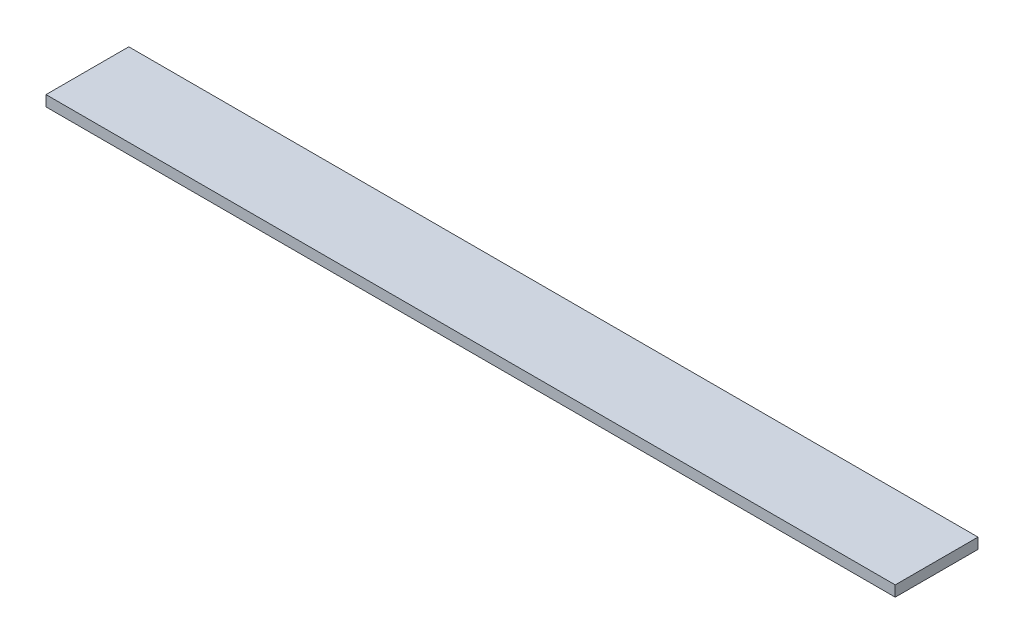
ISO-10303-21;
HEADER;
FILE_DESCRIPTION(('STEP AP214'),'2;1');
FILE_NAME('part.step','',(''),(''),'','','');
FILE_SCHEMA(('AUTOMOTIVE_DESIGN { 1 0 10303 214 1 1 1 1 }'));
ENDSEC;
DATA;
#1=APPLICATION_CONTEXT('core data for automotive mechanical design processes');
#2=APPLICATION_PROTOCOL_DEFINITION('international standard','automotive_design',2000,#1);
#3=PRODUCT_CONTEXT('',#1,'mechanical');
#4=PRODUCT('Part','Part','',(#3));
#5=PRODUCT_RELATED_PRODUCT_CATEGORY('part','',(#4));
#6=PRODUCT_DEFINITION_FORMATION('','',#4);
#7=PRODUCT_DEFINITION_CONTEXT('part definition',#1,'design');
#8=PRODUCT_DEFINITION('design','',#6,#7);
#9=PRODUCT_DEFINITION_SHAPE('','',#8);
#10=(LENGTH_UNIT() NAMED_UNIT(*) SI_UNIT(.MILLI.,.METRE.));
#11=(NAMED_UNIT(*) PLANE_ANGLE_UNIT() SI_UNIT($,.RADIAN.));
#12=(NAMED_UNIT(*) SI_UNIT($,.STERADIAN.) SOLID_ANGLE_UNIT());
#13=UNCERTAINTY_MEASURE_WITH_UNIT(LENGTH_MEASURE(1.E-05),#10,'distance_accuracy_value','');
#14=(GEOMETRIC_REPRESENTATION_CONTEXT(3) GLOBAL_UNCERTAINTY_ASSIGNED_CONTEXT((#13)) GLOBAL_UNIT_ASSIGNED_CONTEXT((#10,
#11,#12)) REPRESENTATION_CONTEXT('',''));
#15=CARTESIAN_POINT('',(0.,0.,0.));
#16=DIRECTION('',(0.,0.,1.));
#17=DIRECTION('',(1.,0.,0.));
#18=AXIS2_PLACEMENT_3D('',#15,#16,#17);
#19=CARTESIAN_POINT('',(1000.,1464.,-90.));
#20=DIRECTION('',(0.,0.,1.));
#21=DIRECTION('',(1.,0.,0.));
#22=AXIS2_PLACEMENT_3D('',#19,#20,#21);
#23=PLANE('',#22);
#24=DIRECTION('',(-1.,0.,0.));
#25=VECTOR('',#24,1.);
#26=CARTESIAN_POINT('',(1000.,1444.,-90.));
#27=LINE('',#26,#25);
#28=CARTESIAN_POINT('',(1000.,1444.,-90.));
#29=VERTEX_POINT('',#28);
#30=CARTESIAN_POINT('',(-590.,1444.,-90.));
#31=VERTEX_POINT('',#30);
#32=EDGE_CURVE('E56',#29,#31,#27,.T.);
#33=ORIENTED_EDGE('',*,*,#32,.F.);
#34=DIRECTION('',(0.,-1.,0.));
#35=VECTOR('',#34,1.);
#36=CARTESIAN_POINT('',(1000.,1464.,-90.));
#37=LINE('',#36,#35);
#38=CARTESIAN_POINT('',(1000.,1464.,-90.));
#39=VERTEX_POINT('',#38);
#40=EDGE_CURVE('E31',#39,#29,#37,.T.);
#41=ORIENTED_EDGE('',*,*,#40,.F.);
#42=DIRECTION('',(-1.,0.,0.));
#43=VECTOR('',#42,1.);
#44=CARTESIAN_POINT('',(1000.,1464.,-90.));
#45=LINE('',#44,#43);
#46=CARTESIAN_POINT('',(-590.,1464.,-90.));
#47=VERTEX_POINT('',#46);
#48=EDGE_CURVE('E58',#39,#47,#45,.T.);
#49=ORIENTED_EDGE('',*,*,#48,.T.);
#50=DIRECTION('',(0.,-1.,0.));
#51=VECTOR('',#50,1.);
#52=CARTESIAN_POINT('',(-590.,1464.,-90.));
#53=LINE('',#52,#51);
#54=EDGE_CURVE('E11',#47,#31,#53,.T.);
#55=ORIENTED_EDGE('',*,*,#54,.T.);
#56=EDGE_LOOP('',(#33,#41,#49,#55));
#57=FACE_BOUND('',#56,.T.);
#58=ADVANCED_FACE('F17',(#57),#23,.T.);
#59=CARTESIAN_POINT('',(-590.,1464.,-90.));
#60=DIRECTION('',(-1.,0.,0.));
#61=DIRECTION('',(0.,0.,1.));
#62=AXIS2_PLACEMENT_3D('',#59,#60,#61);
#63=PLANE('',#62);
#64=DIRECTION('',(0.,0.,-1.));
#65=VECTOR('',#64,1.);
#66=CARTESIAN_POINT('',(-590.,1444.,-90.));
#67=LINE('',#66,#65);
#68=CARTESIAN_POINT('',(-590.,1444.,-245.));
#69=VERTEX_POINT('',#68);
#70=EDGE_CURVE('E63',#31,#69,#67,.T.);
#71=ORIENTED_EDGE('',*,*,#70,.F.);
#72=ORIENTED_EDGE('',*,*,#54,.F.);
#73=DIRECTION('',(0.,0.,-1.));
#74=VECTOR('',#73,1.);
#75=CARTESIAN_POINT('',(-590.,1464.,-90.));
#76=LINE('',#75,#74);
#77=CARTESIAN_POINT('',(-590.,1464.,-245.));
#78=VERTEX_POINT('',#77);
#79=EDGE_CURVE('E77',#47,#78,#76,.T.);
#80=ORIENTED_EDGE('',*,*,#79,.T.);
#81=DIRECTION('',(0.,-1.,0.));
#82=VECTOR('',#81,1.);
#83=CARTESIAN_POINT('',(-590.,1464.,-245.));
#84=LINE('',#83,#82);
#85=EDGE_CURVE('E24',#78,#69,#84,.T.);
#86=ORIENTED_EDGE('',*,*,#85,.T.);
#87=EDGE_LOOP('',(#71,#72,#80,#86));
#88=FACE_BOUND('',#87,.T.);
#89=ADVANCED_FACE('F64',(#88),#63,.T.);
#90=CARTESIAN_POINT('',(-590.,1464.,-245.));
#91=DIRECTION('',(0.,0.,-1.));
#92=DIRECTION('',(-1.,0.,0.));
#93=AXIS2_PLACEMENT_3D('',#90,#91,#92);
#94=PLANE('',#93);
#95=DIRECTION('',(1.,0.,0.));
#96=VECTOR('',#95,1.);
#97=CARTESIAN_POINT('',(-590.,1444.,-245.));
#98=LINE('',#97,#96);
#99=CARTESIAN_POINT('',(1000.,1444.,-245.));
#100=VERTEX_POINT('',#99);
#101=EDGE_CURVE('E68',#69,#100,#98,.T.);
#102=ORIENTED_EDGE('',*,*,#101,.F.);
#103=ORIENTED_EDGE('',*,*,#85,.F.);
#104=DIRECTION('',(1.,0.,0.));
#105=VECTOR('',#104,1.);
#106=CARTESIAN_POINT('',(-590.,1464.,-245.));
#107=LINE('',#106,#105);
#108=CARTESIAN_POINT('',(1000.,1464.,-245.));
#109=VERTEX_POINT('',#108);
#110=EDGE_CURVE('E79',#78,#109,#107,.T.);
#111=ORIENTED_EDGE('',*,*,#110,.T.);
#112=DIRECTION('',(0.,-1.,0.));
#113=VECTOR('',#112,1.);
#114=CARTESIAN_POINT('',(1000.,1464.,-245.));
#115=LINE('',#114,#113);
#116=EDGE_CURVE('E38',#109,#100,#115,.T.);
#117=ORIENTED_EDGE('',*,*,#116,.T.);
#118=EDGE_LOOP('',(#102,#103,#111,#117));
#119=FACE_BOUND('',#118,.T.);
#120=ADVANCED_FACE('F86',(#119),#94,.T.);
#121=CARTESIAN_POINT('',(1000.,1464.,-245.));
#122=DIRECTION('',(1.,0.,0.));
#123=DIRECTION('',(0.,0.,-1.));
#124=AXIS2_PLACEMENT_3D('',#121,#122,#123);
#125=PLANE('',#124);
#126=DIRECTION('',(0.,0.,1.));
#127=VECTOR('',#126,1.);
#128=CARTESIAN_POINT('',(1000.,1444.,-245.));
#129=LINE('',#128,#127);
#130=EDGE_CURVE('E72',#100,#29,#129,.T.);
#131=ORIENTED_EDGE('',*,*,#130,.F.);
#132=ORIENTED_EDGE('',*,*,#116,.F.);
#133=DIRECTION('',(0.,0.,1.));
#134=VECTOR('',#133,1.);
#135=CARTESIAN_POINT('',(1000.,1464.,-245.));
#136=LINE('',#135,#134);
#137=EDGE_CURVE('E81',#109,#39,#136,.T.);
#138=ORIENTED_EDGE('',*,*,#137,.T.);
#139=ORIENTED_EDGE('',*,*,#40,.T.);
#140=EDGE_LOOP('',(#131,#132,#138,#139));
#141=FACE_BOUND('',#140,.T.);
#142=ADVANCED_FACE('F89',(#141),#125,.T.);
#143=CARTESIAN_POINT('',(-590.,1464.,-90.));
#144=DIRECTION('',(0.,-1.,0.));
#145=DIRECTION('',(-1.,0.,0.));
#146=AXIS2_PLACEMENT_3D('',#143,#144,#145);
#147=PLANE('',#146);
#148=ORIENTED_EDGE('',*,*,#48,.F.);
#149=ORIENTED_EDGE('',*,*,#137,.F.);
#150=ORIENTED_EDGE('',*,*,#110,.F.);
#151=ORIENTED_EDGE('',*,*,#79,.F.);
#152=EDGE_LOOP('',(#148,#149,#150,#151));
#153=FACE_BOUND('',#152,.T.);
#154=ADVANCED_FACE('F91',(#153),#147,.F.);
#155=CARTESIAN_POINT('',(-590.,1444.,-90.));
#156=DIRECTION('',(0.,-1.,0.));
#157=DIRECTION('',(-1.,0.,0.));
#158=AXIS2_PLACEMENT_3D('',#155,#156,#157);
#159=PLANE('',#158);
#160=ORIENTED_EDGE('',*,*,#32,.T.);
#161=ORIENTED_EDGE('',*,*,#70,.T.);
#162=ORIENTED_EDGE('',*,*,#101,.T.);
#163=ORIENTED_EDGE('',*,*,#130,.T.);
#164=EDGE_LOOP('',(#160,#161,#162,#163));
#165=FACE_BOUND('',#164,.T.);
#166=ADVANCED_FACE('F71',(#165),#159,.T.);
#167=CLOSED_SHELL('',(#58,#89,#120,#142,#154,#166));
#168=MANIFOLD_SOLID_BREP('B1',#167);
#169=ADVANCED_BREP_SHAPE_REPRESENTATION('',(#18,#168),#14);
#170=SHAPE_DEFINITION_REPRESENTATION(#9,#169);
ENDSEC;
END-ISO-10303-21;
